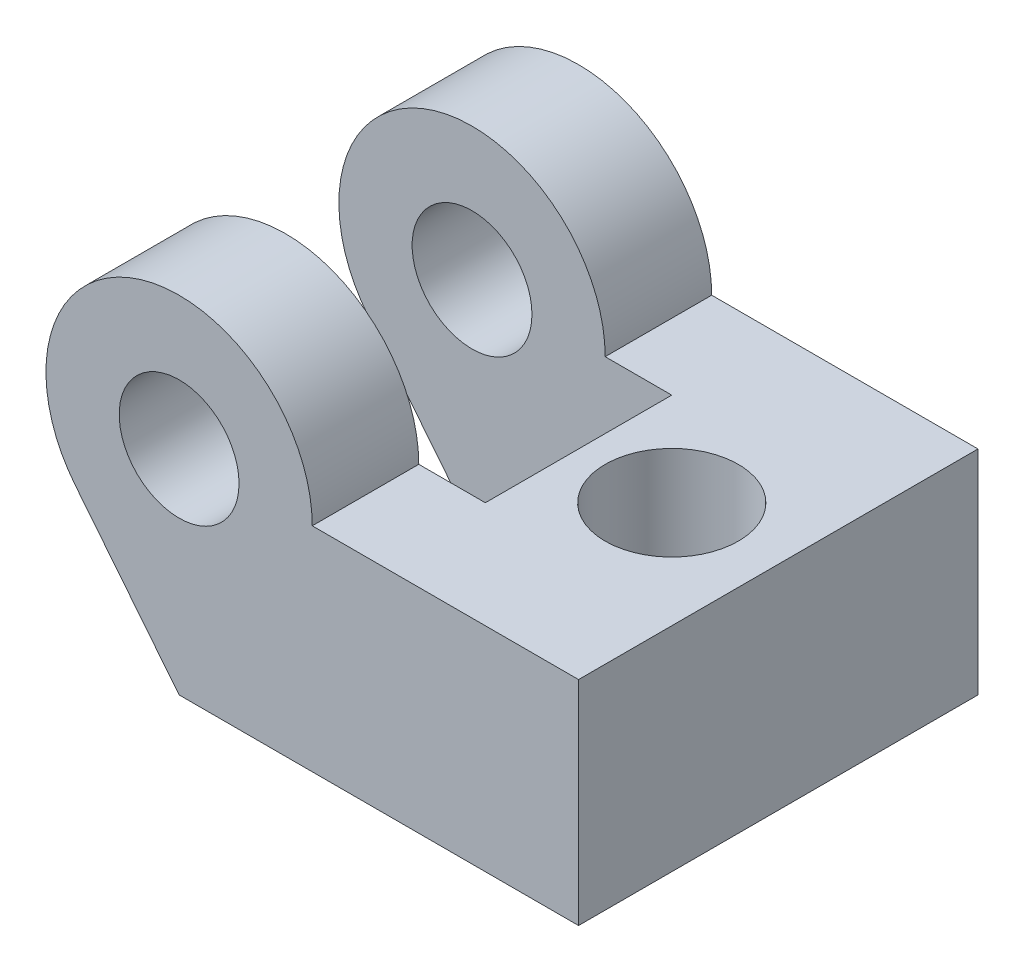
ISO-10303-21;
HEADER;
FILE_DESCRIPTION(('STEP AP214'),'2;1');
FILE_NAME('part.step','',(''),(''),'','','');
FILE_SCHEMA(('AUTOMOTIVE_DESIGN { 1 0 10303 214 1 1 1 1 }'));
ENDSEC;
DATA;
#1=APPLICATION_CONTEXT('core data for automotive mechanical design processes');
#2=APPLICATION_PROTOCOL_DEFINITION('international standard','automotive_design',2000,#1);
#3=PRODUCT_CONTEXT('',#1,'mechanical');
#4=PRODUCT('Part','Part','',(#3));
#5=PRODUCT_RELATED_PRODUCT_CATEGORY('part','',(#4));
#6=PRODUCT_DEFINITION_FORMATION('','',#4);
#7=PRODUCT_DEFINITION_CONTEXT('part definition',#1,'design');
#8=PRODUCT_DEFINITION('design','',#6,#7);
#9=PRODUCT_DEFINITION_SHAPE('','',#8);
#10=(LENGTH_UNIT() NAMED_UNIT(*) SI_UNIT(.MILLI.,.METRE.));
#11=(NAMED_UNIT(*) PLANE_ANGLE_UNIT() SI_UNIT($,.RADIAN.));
#12=(NAMED_UNIT(*) SI_UNIT($,.STERADIAN.) SOLID_ANGLE_UNIT());
#13=UNCERTAINTY_MEASURE_WITH_UNIT(LENGTH_MEASURE(1.E-05),#10,'distance_accuracy_value','');
#14=(GEOMETRIC_REPRESENTATION_CONTEXT(3) GLOBAL_UNCERTAINTY_ASSIGNED_CONTEXT((#13)) GLOBAL_UNIT_ASSIGNED_CONTEXT((#10,
#11,#12)) REPRESENTATION_CONTEXT('',''));
#15=CARTESIAN_POINT('',(0.,0.,0.));
#16=DIRECTION('',(0.,0.,1.));
#17=DIRECTION('',(1.,0.,0.));
#18=AXIS2_PLACEMENT_3D('',#15,#16,#17);
#19=CARTESIAN_POINT('',(0.,8.,0.));
#20=DIRECTION('',(0.,-1.,0.));
#21=DIRECTION('',(0.,0.,-1.));
#22=AXIS2_PLACEMENT_3D('',#19,#20,#21);
#23=PLANE('',#22);
#24=CARTESIAN_POINT('',(-4.,8.,0.));
#25=DIRECTION('',(0.,1.,0.));
#26=DIRECTION('',(0.,0.,1.));
#27=AXIS2_PLACEMENT_3D('',#24,#25,#26);
#28=CIRCLE('',#27,2.5);
#29=CARTESIAN_POINT('',(-4.,8.,2.5));
#30=VERTEX_POINT('',#29);
#31=EDGE_CURVE('E266',#30,#30,#28,.T.);
#32=ORIENTED_EDGE('',*,*,#31,.F.);
#33=EDGE_LOOP('',(#32));
#34=FACE_BOUND('',#33,.T.);
#35=DIRECTION('',(-1.,0.,0.));
#36=VECTOR('',#35,1.);
#37=CARTESIAN_POINT('',(0.,8.,-3.5));
#38=LINE('',#37,#36);
#39=CARTESIAN_POINT('',(-7.5,8.,-3.5));
#40=VERTEX_POINT('',#39);
#41=CARTESIAN_POINT('',(-10.,8.,-3.5));
#42=VERTEX_POINT('',#41);
#43=EDGE_CURVE('E123',#40,#42,#38,.T.);
#44=ORIENTED_EDGE('',*,*,#43,.F.);
#45=DIRECTION('',(0.,0.,-1.));
#46=VECTOR('',#45,1.);
#47=CARTESIAN_POINT('',(-7.5,8.,24.7132034355964));
#48=LINE('',#47,#46);
#49=CARTESIAN_POINT('',(-7.5,8.,3.5));
#50=VERTEX_POINT('',#49);
#51=EDGE_CURVE('E111',#50,#40,#48,.T.);
#52=ORIENTED_EDGE('',*,*,#51,.F.);
#53=DIRECTION('',(-1.,0.,0.));
#54=VECTOR('',#53,1.);
#55=CARTESIAN_POINT('',(0.,8.,3.5));
#56=LINE('',#55,#54);
#57=CARTESIAN_POINT('',(-10.,8.,3.5));
#58=VERTEX_POINT('',#57);
#59=EDGE_CURVE('E117',#50,#58,#56,.T.);
#60=ORIENTED_EDGE('',*,*,#59,.T.);
#61=DIRECTION('',(0.,0.,1.));
#62=VECTOR('',#61,1.);
#63=CARTESIAN_POINT('',(-10.,8.,-16.4012194668567));
#64=LINE('',#63,#62);
#65=CARTESIAN_POINT('',(-10.,8.,7.5));
#66=VERTEX_POINT('',#65);
#67=EDGE_CURVE('E43',#58,#66,#64,.T.);
#68=ORIENTED_EDGE('',*,*,#67,.T.);
#69=DIRECTION('',(1.,0.,0.));
#70=VECTOR('',#69,1.);
#71=CARTESIAN_POINT('',(0.,8.,7.5));
#72=LINE('',#71,#70);
#73=CARTESIAN_POINT('',(0.,8.,7.5));
#74=VERTEX_POINT('',#73);
#75=EDGE_CURVE('E170',#66,#74,#72,.T.);
#76=ORIENTED_EDGE('',*,*,#75,.T.);
#77=DIRECTION('',(0.,0.,-1.));
#78=VECTOR('',#77,1.);
#79=CARTESIAN_POINT('',(0.,8.,-7.5));
#80=LINE('',#79,#78);
#81=CARTESIAN_POINT('',(0.,8.,-7.5));
#82=VERTEX_POINT('',#81);
#83=EDGE_CURVE('E166',#74,#82,#80,.T.);
#84=ORIENTED_EDGE('',*,*,#83,.T.);
#85=DIRECTION('',(-1.,0.,0.));
#86=VECTOR('',#85,1.);
#87=CARTESIAN_POINT('',(0.,8.,-7.5));
#88=LINE('',#87,#86);
#89=CARTESIAN_POINT('',(-10.,8.,-7.5));
#90=VERTEX_POINT('',#89);
#91=EDGE_CURVE('E58',#82,#90,#88,.T.);
#92=ORIENTED_EDGE('',*,*,#91,.T.);
#93=DIRECTION('',(0.,0.,-1.));
#94=VECTOR('',#93,1.);
#95=CARTESIAN_POINT('',(-10.,8.,16.4012194668567));
#96=LINE('',#95,#94);
#97=EDGE_CURVE('E12',#42,#90,#96,.T.);
#98=ORIENTED_EDGE('',*,*,#97,.F.);
#99=EDGE_LOOP('',(#44,#52,#60,#68,#76,#84,#92,#98));
#100=FACE_BOUND('',#99,.T.);
#101=ADVANCED_FACE('F34',(#34,#100),#23,.F.);
#102=CARTESIAN_POINT('',(-15.,8.,-7.5));
#103=DIRECTION('',(1.,0.,0.));
#104=DIRECTION('',(0.,0.,-1.));
#105=AXIS2_PLACEMENT_3D('',#102,#103,#104);
#106=PLANE('',#105);
#107=DIRECTION('',(0.,0.,-1.));
#108=VECTOR('',#107,1.);
#109=CARTESIAN_POINT('',(-15.,0.500000000000001,24.7132034355964));
#110=LINE('',#109,#108);
#111=CARTESIAN_POINT('',(-15.,0.500000000000001,-3.5));
#112=VERTEX_POINT('',#111);
#113=CARTESIAN_POINT('',(-15.,0.500000000000001,3.5));
#114=VERTEX_POINT('',#113);
#115=EDGE_CURVE('E118',#112,#114,#110,.F.);
#116=ORIENTED_EDGE('',*,*,#115,.F.);
#117=DIRECTION('',(0.,1.,0.));
#118=VECTOR('',#117,1.);
#119=CARTESIAN_POINT('',(-15.,0.,-3.5));
#120=LINE('',#119,#118);
#121=CARTESIAN_POINT('',(-15.,0.,-3.5));
#122=VERTEX_POINT('',#121);
#123=EDGE_CURVE('E125',#122,#112,#120,.T.);
#124=ORIENTED_EDGE('',*,*,#123,.F.);
#125=DIRECTION('',(0.,0.,1.));
#126=VECTOR('',#125,1.);
#127=CARTESIAN_POINT('',(-15.,0.,-7.5));
#128=LINE('',#127,#126);
#129=CARTESIAN_POINT('',(-15.,0.,3.5));
#130=VERTEX_POINT('',#129);
#131=EDGE_CURVE('E177',#122,#130,#128,.T.);
#132=ORIENTED_EDGE('',*,*,#131,.T.);
#133=DIRECTION('',(0.,-1.,0.));
#134=VECTOR('',#133,1.);
#135=CARTESIAN_POINT('',(-15.,8.,3.5));
#136=LINE('',#135,#134);
#137=EDGE_CURVE('E163',#114,#130,#136,.T.);
#138=ORIENTED_EDGE('',*,*,#137,.F.);
#139=EDGE_LOOP('',(#116,#124,#132,#138));
#140=FACE_BOUND('',#139,.T.);
#141=ADVANCED_FACE('F223',(#140),#106,.F.);
#142=CARTESIAN_POINT('',(0.,8.,-7.5));
#143=DIRECTION('',(-1.,0.,0.));
#144=DIRECTION('',(0.,0.,1.));
#145=AXIS2_PLACEMENT_3D('',#142,#143,#144);
#146=PLANE('',#145);
#147=DIRECTION('',(0.,0.,-1.));
#148=VECTOR('',#147,1.);
#149=CARTESIAN_POINT('',(0.,0.,-7.5));
#150=LINE('',#149,#148);
#151=CARTESIAN_POINT('',(0.,0.,7.5));
#152=VERTEX_POINT('',#151);
#153=CARTESIAN_POINT('',(0.,0.,-7.5));
#154=VERTEX_POINT('',#153);
#155=EDGE_CURVE('E165',#152,#154,#150,.T.);
#156=ORIENTED_EDGE('',*,*,#155,.T.);
#157=DIRECTION('',(0.,-1.,0.));
#158=VECTOR('',#157,1.);
#159=CARTESIAN_POINT('',(0.,8.,-7.5));
#160=LINE('',#159,#158);
#161=EDGE_CURVE('E184',#82,#154,#160,.T.);
#162=ORIENTED_EDGE('',*,*,#161,.F.);
#163=ORIENTED_EDGE('',*,*,#83,.F.);
#164=DIRECTION('',(0.,-1.,0.));
#165=VECTOR('',#164,1.);
#166=CARTESIAN_POINT('',(0.,8.,7.5));
#167=LINE('',#166,#165);
#168=EDGE_CURVE('E172',#74,#152,#167,.T.);
#169=ORIENTED_EDGE('',*,*,#168,.T.);
#170=EDGE_LOOP('',(#156,#162,#163,#169));
#171=FACE_BOUND('',#170,.T.);
#172=ADVANCED_FACE('F36',(#171),#146,.F.);
#173=CARTESIAN_POINT('',(0.,8.,-7.5));
#174=DIRECTION('',(0.,0.,1.));
#175=DIRECTION('',(1.,0.,0.));
#176=AXIS2_PLACEMENT_3D('',#173,#174,#175);
#177=PLANE('',#176);
#178=CARTESIAN_POINT('',(-15.,8.,-7.5));
#179=DIRECTION('',(0.,0.,1.));
#180=DIRECTION('',(1.,0.,0.));
#181=AXIS2_PLACEMENT_3D('',#178,#179,#180);
#182=CIRCLE('',#181,2.25);
#183=CARTESIAN_POINT('',(-12.75,8.,-7.5));
#184=VERTEX_POINT('',#183);
#185=EDGE_CURVE('E257',#184,#184,#182,.T.);
#186=ORIENTED_EDGE('',*,*,#185,.T.);
#187=EDGE_LOOP('',(#186));
#188=FACE_BOUND('',#187,.T.);
#189=DIRECTION('',(-1.,0.,0.));
#190=VECTOR('',#189,1.);
#191=CARTESIAN_POINT('',(0.,0.,-7.5));
#192=LINE('',#191,#190);
#193=CARTESIAN_POINT('',(-15.,0.,-7.5));
#194=VERTEX_POINT('',#193);
#195=EDGE_CURVE('E175',#154,#194,#192,.T.);
#196=ORIENTED_EDGE('',*,*,#195,.T.);
#197=DIRECTION('',(0.625,-0.7806247497998,0.));
#198=VECTOR('',#197,1.);
#199=CARTESIAN_POINT('',(-18.903123748999,4.875,-7.5));
#200=LINE('',#199,#198);
#201=CARTESIAN_POINT('',(-18.903123748999,4.875,-7.5));
#202=VERTEX_POINT('',#201);
#203=EDGE_CURVE('E137',#202,#194,#200,.T.);
#204=ORIENTED_EDGE('',*,*,#203,.F.);
#205=CARTESIAN_POINT('',(-15.,8.,-7.5));
#206=DIRECTION('',(0.,0.,1.));
#207=DIRECTION('',(1.,0.,0.));
#208=AXIS2_PLACEMENT_3D('',#205,#206,#207);
#209=CIRCLE('',#208,5.);
#210=EDGE_CURVE('E134',#90,#202,#209,.T.);
#211=ORIENTED_EDGE('',*,*,#210,.F.);
#212=ORIENTED_EDGE('',*,*,#91,.F.);
#213=ORIENTED_EDGE('',*,*,#161,.T.);
#214=EDGE_LOOP('',(#196,#204,#211,#212,#213));
#215=FACE_BOUND('',#214,.T.);
#216=ADVANCED_FACE('F212',(#188,#215),#177,.F.);
#217=CARTESIAN_POINT('',(0.,8.,7.5));
#218=DIRECTION('',(0.,0.,-1.));
#219=DIRECTION('',(-1.,0.,0.));
#220=AXIS2_PLACEMENT_3D('',#217,#218,#219);
#221=PLANE('',#220);
#222=CARTESIAN_POINT('',(-15.,8.,7.5));
#223=DIRECTION('',(0.,0.,1.));
#224=DIRECTION('',(1.,0.,0.));
#225=AXIS2_PLACEMENT_3D('',#222,#223,#224);
#226=CIRCLE('',#225,2.25);
#227=CARTESIAN_POINT('',(-12.75,8.,7.5));
#228=VERTEX_POINT('',#227);
#229=EDGE_CURVE('E259',#228,#228,#226,.T.);
#230=ORIENTED_EDGE('',*,*,#229,.F.);
#231=EDGE_LOOP('',(#230));
#232=FACE_BOUND('',#231,.T.);
#233=ORIENTED_EDGE('',*,*,#75,.F.);
#234=CARTESIAN_POINT('',(-15.,8.,7.5));
#235=DIRECTION('',(0.,0.,1.));
#236=DIRECTION('',(1.,0.,0.));
#237=AXIS2_PLACEMENT_3D('',#234,#235,#236);
#238=CIRCLE('',#237,5.);
#239=CARTESIAN_POINT('',(-18.903123748999,4.875,7.5));
#240=VERTEX_POINT('',#239);
#241=EDGE_CURVE('E143',#66,#240,#238,.T.);
#242=ORIENTED_EDGE('',*,*,#241,.T.);
#243=DIRECTION('',(0.625,-0.7806247497998,0.));
#244=VECTOR('',#243,1.);
#245=CARTESIAN_POINT('',(-18.903123748999,4.875,7.5));
#246=LINE('',#245,#244);
#247=CARTESIAN_POINT('',(-15.,0.,7.5));
#248=VERTEX_POINT('',#247);
#249=EDGE_CURVE('E153',#240,#248,#246,.T.);
#250=ORIENTED_EDGE('',*,*,#249,.T.);
#251=DIRECTION('',(1.,0.,0.));
#252=VECTOR('',#251,1.);
#253=CARTESIAN_POINT('',(0.,0.,7.5));
#254=LINE('',#253,#252);
#255=EDGE_CURVE('E168',#248,#152,#254,.T.);
#256=ORIENTED_EDGE('',*,*,#255,.T.);
#257=ORIENTED_EDGE('',*,*,#168,.F.);
#258=EDGE_LOOP('',(#233,#242,#250,#256,#257));
#259=FACE_BOUND('',#258,.T.);
#260=ADVANCED_FACE('F194',(#232,#259),#221,.F.);
#261=CARTESIAN_POINT('',(0.,0.,0.));
#262=DIRECTION('',(0.,-1.,0.));
#263=DIRECTION('',(0.,0.,-1.));
#264=AXIS2_PLACEMENT_3D('',#261,#262,#263);
#265=PLANE('',#264);
#266=CARTESIAN_POINT('',(-4.,0.,0.));
#267=DIRECTION('',(0.,1.,0.));
#268=DIRECTION('',(0.,0.,1.));
#269=AXIS2_PLACEMENT_3D('',#266,#267,#268);
#270=CIRCLE('',#269,2.5);
#271=CARTESIAN_POINT('',(-4.,0.,2.5));
#272=VERTEX_POINT('',#271);
#273=EDGE_CURVE('E263',#272,#272,#270,.T.);
#274=ORIENTED_EDGE('',*,*,#273,.T.);
#275=EDGE_LOOP('',(#274));
#276=FACE_BOUND('',#275,.T.);
#277=ORIENTED_EDGE('',*,*,#155,.F.);
#278=ORIENTED_EDGE('',*,*,#255,.F.);
#279=DIRECTION('',(0.,0.,1.));
#280=VECTOR('',#279,1.);
#281=CARTESIAN_POINT('',(-15.,0.,-16.4012194668567));
#282=LINE('',#281,#280);
#283=EDGE_CURVE('E151',#130,#248,#282,.T.);
#284=ORIENTED_EDGE('',*,*,#283,.F.);
#285=ORIENTED_EDGE('',*,*,#131,.F.);
#286=EDGE_CURVE('E178',#194,#122,#128,.T.);
#287=ORIENTED_EDGE('',*,*,#286,.F.);
#288=ORIENTED_EDGE('',*,*,#195,.F.);
#289=EDGE_LOOP('',(#277,#278,#284,#285,#287,#288));
#290=FACE_BOUND('',#289,.T.);
#291=ADVANCED_FACE('F207',(#276,#290),#265,.T.);
#292=CARTESIAN_POINT('',(-15.,8.,-16.4012194668567));
#293=DIRECTION('',(0.,0.,1.));
#294=DIRECTION('',(1.,0.,0.));
#295=AXIS2_PLACEMENT_3D('',#292,#293,#294);
#296=CYLINDRICAL_SURFACE('',#295,5.);
#297=ORIENTED_EDGE('',*,*,#67,.F.);
#298=CARTESIAN_POINT('',(-15.,8.,3.5));
#299=DIRECTION('',(0.,0.,1.));
#300=DIRECTION('',(1.,0.,0.));
#301=AXIS2_PLACEMENT_3D('',#298,#299,#300);
#302=CIRCLE('',#301,5.);
#303=CARTESIAN_POINT('',(-18.903123748999,4.875,3.5));
#304=VERTEX_POINT('',#303);
#305=EDGE_CURVE('E150',#304,#58,#302,.F.);
#306=ORIENTED_EDGE('',*,*,#305,.F.);
#307=DIRECTION('',(0.,0.,1.));
#308=VECTOR('',#307,1.);
#309=CARTESIAN_POINT('',(-18.903123748999,4.875,-16.4012194668567));
#310=LINE('',#309,#308);
#311=EDGE_CURVE('E156',#304,#240,#310,.T.);
#312=ORIENTED_EDGE('',*,*,#311,.T.);
#313=ORIENTED_EDGE('',*,*,#241,.F.);
#314=EDGE_LOOP('',(#297,#306,#312,#313));
#315=FACE_BOUND('',#314,.T.);
#316=ADVANCED_FACE('F196',(#315),#296,.T.);
#317=CARTESIAN_POINT('',(0.,0.,3.5));
#318=DIRECTION('',(0.,0.,1.));
#319=DIRECTION('',(1.,0.,0.));
#320=AXIS2_PLACEMENT_3D('',#317,#318,#319);
#321=PLANE('',#320);
#322=CARTESIAN_POINT('',(-15.,8.,3.5));
#323=DIRECTION('',(0.,0.,1.));
#324=DIRECTION('',(1.,0.,0.));
#325=AXIS2_PLACEMENT_3D('',#322,#323,#324);
#326=CIRCLE('',#325,2.25);
#327=CARTESIAN_POINT('',(-12.75,8.,3.5));
#328=VERTEX_POINT('',#327);
#329=EDGE_CURVE('E126',#328,#328,#326,.T.);
#330=ORIENTED_EDGE('',*,*,#329,.T.);
#331=EDGE_LOOP('',(#330));
#332=FACE_BOUND('',#331,.T.);
#333=ORIENTED_EDGE('',*,*,#305,.T.);
#334=ORIENTED_EDGE('',*,*,#59,.F.);
#335=CARTESIAN_POINT('',(-15.,8.,3.5));
#336=DIRECTION('',(0.,0.,1.));
#337=DIRECTION('',(1.,0.,0.));
#338=AXIS2_PLACEMENT_3D('',#335,#336,#337);
#339=CIRCLE('',#338,7.5);
#340=EDGE_CURVE('E50',#114,#50,#339,.T.);
#341=ORIENTED_EDGE('',*,*,#340,.F.);
#342=ORIENTED_EDGE('',*,*,#137,.T.);
#343=DIRECTION('',(-0.625,0.7806247497998,0.));
#344=VECTOR('',#343,1.);
#345=CARTESIAN_POINT('',(-18.903123748999,4.875,3.5));
#346=LINE('',#345,#344);
#347=EDGE_CURVE('E148',#130,#304,#346,.T.);
#348=ORIENTED_EDGE('',*,*,#347,.T.);
#349=EDGE_LOOP('',(#333,#334,#341,#342,#348));
#350=FACE_BOUND('',#349,.T.);
#351=ADVANCED_FACE('F224',(#332,#350),#321,.F.);
#352=CARTESIAN_POINT('',(-18.903123748999,4.875,-16.4012194668567));
#353=DIRECTION('',(-0.7806247497998,-0.625,0.));
#354=DIRECTION('',(0.625,-0.7806247497998,0.));
#355=AXIS2_PLACEMENT_3D('',#352,#353,#354);
#356=PLANE('',#355);
#357=ORIENTED_EDGE('',*,*,#347,.F.);
#358=ORIENTED_EDGE('',*,*,#283,.T.);
#359=ORIENTED_EDGE('',*,*,#249,.F.);
#360=ORIENTED_EDGE('',*,*,#311,.F.);
#361=EDGE_LOOP('',(#357,#358,#359,#360));
#362=FACE_BOUND('',#361,.T.);
#363=ADVANCED_FACE('F201',(#362),#356,.T.);
#364=CARTESIAN_POINT('',(-15.,8.,16.4012194668567));
#365=DIRECTION('',(0.,0.,-1.));
#366=DIRECTION('',(-1.,0.,0.));
#367=AXIS2_PLACEMENT_3D('',#364,#365,#366);
#368=CYLINDRICAL_SURFACE('',#367,5.);
#369=CARTESIAN_POINT('',(-15.,8.,-3.5));
#370=DIRECTION('',(0.,0.,1.));
#371=DIRECTION('',(1.,0.,0.));
#372=AXIS2_PLACEMENT_3D('',#369,#370,#371);
#373=CIRCLE('',#372,5.);
#374=CARTESIAN_POINT('',(-18.903123748999,4.875,-3.5));
#375=VERTEX_POINT('',#374);
#376=EDGE_CURVE('E141',#42,#375,#373,.T.);
#377=ORIENTED_EDGE('',*,*,#376,.F.);
#378=ORIENTED_EDGE('',*,*,#97,.T.);
#379=ORIENTED_EDGE('',*,*,#210,.T.);
#380=DIRECTION('',(0.,0.,-1.));
#381=VECTOR('',#380,1.);
#382=CARTESIAN_POINT('',(-18.903123748999,4.875,16.4012194668567));
#383=LINE('',#382,#381);
#384=EDGE_CURVE('E136',#375,#202,#383,.T.);
#385=ORIENTED_EDGE('',*,*,#384,.F.);
#386=EDGE_LOOP('',(#377,#378,#379,#385));
#387=FACE_BOUND('',#386,.T.);
#388=ADVANCED_FACE('F216',(#387),#368,.T.);
#389=CARTESIAN_POINT('',(0.,0.,-3.5));
#390=DIRECTION('',(0.,0.,1.));
#391=DIRECTION('',(1.,0.,0.));
#392=AXIS2_PLACEMENT_3D('',#389,#390,#391);
#393=PLANE('',#392);
#394=CARTESIAN_POINT('',(-15.,8.,-3.5));
#395=DIRECTION('',(0.,0.,1.));
#396=DIRECTION('',(1.,0.,0.));
#397=AXIS2_PLACEMENT_3D('',#394,#395,#396);
#398=CIRCLE('',#397,2.25);
#399=CARTESIAN_POINT('',(-12.75,8.,-3.5));
#400=VERTEX_POINT('',#399);
#401=EDGE_CURVE('E38',#400,#400,#398,.T.);
#402=ORIENTED_EDGE('',*,*,#401,.F.);
#403=EDGE_LOOP('',(#402));
#404=FACE_BOUND('',#403,.T.);
#405=DIRECTION('',(0.625,-0.7806247497998,0.));
#406=VECTOR('',#405,1.);
#407=CARTESIAN_POINT('',(-18.903123748999,4.875,-3.5));
#408=LINE('',#407,#406);
#409=EDGE_CURVE('E140',#375,#122,#408,.T.);
#410=ORIENTED_EDGE('',*,*,#409,.T.);
#411=ORIENTED_EDGE('',*,*,#123,.T.);
#412=CARTESIAN_POINT('',(-15.,8.,-3.5));
#413=DIRECTION('',(0.,0.,1.));
#414=DIRECTION('',(1.,0.,0.));
#415=AXIS2_PLACEMENT_3D('',#412,#413,#414);
#416=CIRCLE('',#415,7.5);
#417=EDGE_CURVE('E114',#112,#40,#416,.T.);
#418=ORIENTED_EDGE('',*,*,#417,.T.);
#419=ORIENTED_EDGE('',*,*,#43,.T.);
#420=ORIENTED_EDGE('',*,*,#376,.T.);
#421=EDGE_LOOP('',(#410,#411,#418,#419,#420));
#422=FACE_BOUND('',#421,.T.);
#423=ADVANCED_FACE('F122',(#404,#422),#393,.T.);
#424=CARTESIAN_POINT('',(-18.903123748999,4.875,16.4012194668567));
#425=DIRECTION('',(0.7806247497998,0.625,0.));
#426=DIRECTION('',(-0.625,0.7806247497998,0.));
#427=AXIS2_PLACEMENT_3D('',#424,#425,#426);
#428=PLANE('',#427);
#429=ORIENTED_EDGE('',*,*,#409,.F.);
#430=ORIENTED_EDGE('',*,*,#384,.T.);
#431=ORIENTED_EDGE('',*,*,#203,.T.);
#432=ORIENTED_EDGE('',*,*,#286,.T.);
#433=EDGE_LOOP('',(#429,#430,#431,#432));
#434=FACE_BOUND('',#433,.T.);
#435=ADVANCED_FACE('F219',(#434),#428,.F.);
#436=CARTESIAN_POINT('',(-15.,8.,24.7132034355964));
#437=DIRECTION('',(0.,0.,-1.));
#438=DIRECTION('',(-1.,0.,0.));
#439=AXIS2_PLACEMENT_3D('',#436,#437,#438);
#440=CYLINDRICAL_SURFACE('',#439,7.5);
#441=ORIENTED_EDGE('',*,*,#51,.T.);
#442=ORIENTED_EDGE('',*,*,#417,.F.);
#443=ORIENTED_EDGE('',*,*,#115,.T.);
#444=ORIENTED_EDGE('',*,*,#340,.T.);
#445=EDGE_LOOP('',(#441,#442,#443,#444));
#446=FACE_BOUND('',#445,.T.);
#447=ADVANCED_FACE('F113',(#446),#440,.F.);
#448=CARTESIAN_POINT('',(-15.,8.,-7.5));
#449=DIRECTION('',(0.,0.,1.));
#450=DIRECTION('',(1.,0.,0.));
#451=AXIS2_PLACEMENT_3D('',#448,#449,#450);
#452=CYLINDRICAL_SURFACE('',#451,2.25);
#453=CARTESIAN_POINT('',(-12.75,8.,-3.5));
#454=CARTESIAN_POINT('',(-12.75,8.,-3.54166666666667));
#455=CARTESIAN_POINT('',(-12.75,8.,-3.58333333333333));
#456=CARTESIAN_POINT('',(-12.75,8.,-3.66666666666667));
#457=CARTESIAN_POINT('',(-12.75,8.,-3.70833333333333));
#458=CARTESIAN_POINT('',(-12.75,8.,-3.79166666666667));
#459=CARTESIAN_POINT('',(-12.75,8.,-3.83333333333333));
#460=CARTESIAN_POINT('',(-12.75,8.,-3.91666666666667));
#461=CARTESIAN_POINT('',(-12.75,8.,-3.95833333333333));
#462=CARTESIAN_POINT('',(-12.75,8.,-4.04166666666667));
#463=CARTESIAN_POINT('',(-12.75,8.,-4.08333333333333));
#464=CARTESIAN_POINT('',(-12.75,8.,-4.16666666666667));
#465=CARTESIAN_POINT('',(-12.75,8.,-4.20833333333333));
#466=CARTESIAN_POINT('',(-12.75,8.,-4.29166666666667));
#467=CARTESIAN_POINT('',(-12.75,8.,-4.33333333333333));
#468=CARTESIAN_POINT('',(-12.75,8.,-4.41666666666667));
#469=CARTESIAN_POINT('',(-12.75,8.,-4.45833333333333));
#470=CARTESIAN_POINT('',(-12.75,8.,-4.54166666666667));
#471=CARTESIAN_POINT('',(-12.75,8.,-4.58333333333333));
#472=CARTESIAN_POINT('',(-12.75,8.,-4.66666666666667));
#473=CARTESIAN_POINT('',(-12.75,8.,-4.70833333333333));
#474=CARTESIAN_POINT('',(-12.75,8.,-4.79166666666667));
#475=CARTESIAN_POINT('',(-12.75,8.,-4.83333333333333));
#476=CARTESIAN_POINT('',(-12.75,8.,-4.91666666666667));
#477=CARTESIAN_POINT('',(-12.75,8.,-4.95833333333333));
#478=CARTESIAN_POINT('',(-12.75,8.,-5.04166666666667));
#479=CARTESIAN_POINT('',(-12.75,8.,-5.08333333333333));
#480=CARTESIAN_POINT('',(-12.75,8.,-5.16666666666667));
#481=CARTESIAN_POINT('',(-12.75,8.,-5.20833333333333));
#482=CARTESIAN_POINT('',(-12.75,8.,-5.29166666666667));
#483=CARTESIAN_POINT('',(-12.75,8.,-5.33333333333333));
#484=CARTESIAN_POINT('',(-12.75,8.,-5.41666666666667));
#485=CARTESIAN_POINT('',(-12.75,8.,-5.45833333333333));
#486=CARTESIAN_POINT('',(-12.75,8.,-5.54166666666667));
#487=CARTESIAN_POINT('',(-12.75,8.,-5.58333333333333));
#488=CARTESIAN_POINT('',(-12.75,8.,-5.66666666666667));
#489=CARTESIAN_POINT('',(-12.75,8.,-5.70833333333333));
#490=CARTESIAN_POINT('',(-12.75,8.,-5.79166666666667));
#491=CARTESIAN_POINT('',(-12.75,8.,-5.83333333333334));
#492=CARTESIAN_POINT('',(-12.75,8.,-5.91666666666667));
#493=CARTESIAN_POINT('',(-12.75,8.,-5.95833333333334));
#494=CARTESIAN_POINT('',(-12.75,8.,-6.04166666666667));
#495=CARTESIAN_POINT('',(-12.75,8.,-6.08333333333334));
#496=CARTESIAN_POINT('',(-12.75,8.,-6.16666666666667));
#497=CARTESIAN_POINT('',(-12.75,8.,-6.20833333333334));
#498=CARTESIAN_POINT('',(-12.75,8.,-6.29166666666667));
#499=CARTESIAN_POINT('',(-12.75,8.,-6.33333333333334));
#500=CARTESIAN_POINT('',(-12.75,8.,-6.41666666666667));
#501=CARTESIAN_POINT('',(-12.75,8.,-6.45833333333333));
#502=CARTESIAN_POINT('',(-12.75,8.,-6.54166666666667));
#503=CARTESIAN_POINT('',(-12.75,8.,-6.58333333333333));
#504=CARTESIAN_POINT('',(-12.75,8.,-6.66666666666667));
#505=CARTESIAN_POINT('',(-12.75,8.,-6.70833333333333));
#506=CARTESIAN_POINT('',(-12.75,8.,-6.79166666666667));
#507=CARTESIAN_POINT('',(-12.75,8.,-6.83333333333334));
#508=CARTESIAN_POINT('',(-12.75,8.,-6.91666666666667));
#509=CARTESIAN_POINT('',(-12.75,8.,-6.95833333333334));
#510=CARTESIAN_POINT('',(-12.75,8.,-7.04166666666667));
#511=CARTESIAN_POINT('',(-12.75,8.,-7.08333333333334));
#512=CARTESIAN_POINT('',(-12.75,8.,-7.16666666666667));
#513=CARTESIAN_POINT('',(-12.75,8.,-7.20833333333334));
#514=CARTESIAN_POINT('',(-12.75,8.,-7.29166666666667));
#515=CARTESIAN_POINT('',(-12.75,8.,-7.33333333333334));
#516=CARTESIAN_POINT('',(-12.75,8.,-7.41666666666667));
#517=CARTESIAN_POINT('',(-12.75,8.,-7.45833333333334));
#518=CARTESIAN_POINT('',(-12.75,8.,-7.5));
#519=B_SPLINE_CURVE_WITH_KNOTS('',3,(#453,#454,#455,#456,#457,#458,#459,#460,#461,#462,#463,
#464,#465,#466,#467,#468,#469,#470,#471,#472,#473,#474,#475,#476,#477,#478,#479,#480,#481,#482,
#483,#484,#485,#486,#487,#488,#489,#490,#491,#492,#493,#494,#495,#496,#497,#498,#499,#500,#501,
#502,#503,#504,#505,#506,#507,#508,#509,#510,#511,#512,#513,#514,#515,#516,#517,#518),
.UNSPECIFIED.,.F.,.F.,(4,2,2,2,2,2,2,2,2,2,2,2,2,2,2,2,2,2,2,2,2,2,2,2,2,2,2,2,2,2,2,2,4),(0.,
0.125,0.25,0.375,0.5,0.625,0.75,0.875,1.,1.125,1.25,1.375,1.5,1.625,1.75,1.875,2.,2.125,2.25,
2.375,2.5,2.625,2.75,2.875,3.,3.125,3.25,3.375,3.5,3.625,3.75,3.875,4.),.UNSPECIFIED.);
#520=EDGE_CURVE('BSEAM274',#400,#184,#519,.T.);
#521=ORIENTED_EDGE('',*,*,#401,.T.);
#522=ORIENTED_EDGE('',*,*,#185,.F.);
#523=ORIENTED_EDGE('',*,*,#520,.T.);
#524=ORIENTED_EDGE('',*,*,#520,.F.);
#525=EDGE_LOOP('',(#521,#523,#522,#524));
#526=FACE_BOUND('',#525,.T.);
#527=ADVANCED_FACE('F274',(#526),#452,.F.);
#528=CARTESIAN_POINT('',(-12.75,8.,7.5));
#529=CARTESIAN_POINT('',(-12.75,8.,7.45833333333333));
#530=CARTESIAN_POINT('',(-12.75,8.,7.41666666666667));
#531=CARTESIAN_POINT('',(-12.75,8.,7.33333333333333));
#532=CARTESIAN_POINT('',(-12.75,8.,7.29166666666667));
#533=CARTESIAN_POINT('',(-12.75,8.,7.20833333333333));
#534=CARTESIAN_POINT('',(-12.75,8.,7.16666666666667));
#535=CARTESIAN_POINT('',(-12.75,8.,7.08333333333333));
#536=CARTESIAN_POINT('',(-12.75,8.,7.04166666666667));
#537=CARTESIAN_POINT('',(-12.75,8.,6.95833333333333));
#538=CARTESIAN_POINT('',(-12.75,8.,6.91666666666667));
#539=CARTESIAN_POINT('',(-12.75,8.,6.83333333333333));
#540=CARTESIAN_POINT('',(-12.75,8.,6.79166666666667));
#541=CARTESIAN_POINT('',(-12.75,8.,6.70833333333333));
#542=CARTESIAN_POINT('',(-12.75,8.,6.66666666666667));
#543=CARTESIAN_POINT('',(-12.75,8.,6.58333333333333));
#544=CARTESIAN_POINT('',(-12.75,8.,6.54166666666667));
#545=CARTESIAN_POINT('',(-12.75,8.,6.45833333333333));
#546=CARTESIAN_POINT('',(-12.75,8.,6.41666666666667));
#547=CARTESIAN_POINT('',(-12.75,8.,6.33333333333333));
#548=CARTESIAN_POINT('',(-12.75,8.,6.29166666666667));
#549=CARTESIAN_POINT('',(-12.75,8.,6.20833333333333));
#550=CARTESIAN_POINT('',(-12.75,8.,6.16666666666667));
#551=CARTESIAN_POINT('',(-12.75,8.,6.08333333333333));
#552=CARTESIAN_POINT('',(-12.75,8.,6.04166666666667));
#553=CARTESIAN_POINT('',(-12.75,8.,5.95833333333333));
#554=CARTESIAN_POINT('',(-12.75,8.,5.91666666666667));
#555=CARTESIAN_POINT('',(-12.75,8.,5.83333333333333));
#556=CARTESIAN_POINT('',(-12.75,8.,5.79166666666667));
#557=CARTESIAN_POINT('',(-12.75,8.,5.70833333333333));
#558=CARTESIAN_POINT('',(-12.75,8.,5.66666666666667));
#559=CARTESIAN_POINT('',(-12.75,8.,5.58333333333333));
#560=CARTESIAN_POINT('',(-12.75,8.,5.54166666666667));
#561=CARTESIAN_POINT('',(-12.75,8.,5.45833333333333));
#562=CARTESIAN_POINT('',(-12.75,8.,5.41666666666667));
#563=CARTESIAN_POINT('',(-12.75,8.,5.33333333333333));
#564=CARTESIAN_POINT('',(-12.75,8.,5.29166666666667));
#565=CARTESIAN_POINT('',(-12.75,8.,5.20833333333333));
#566=CARTESIAN_POINT('',(-12.75,8.,5.16666666666667));
#567=CARTESIAN_POINT('',(-12.75,8.,5.08333333333333));
#568=CARTESIAN_POINT('',(-12.75,8.,5.04166666666667));
#569=CARTESIAN_POINT('',(-12.75,8.,4.95833333333333));
#570=CARTESIAN_POINT('',(-12.75,8.,4.91666666666667));
#571=CARTESIAN_POINT('',(-12.75,8.,4.83333333333333));
#572=CARTESIAN_POINT('',(-12.75,8.,4.79166666666667));
#573=CARTESIAN_POINT('',(-12.75,8.,4.70833333333333));
#574=CARTESIAN_POINT('',(-12.75,8.,4.66666666666667));
#575=CARTESIAN_POINT('',(-12.75,8.,4.58333333333333));
#576=CARTESIAN_POINT('',(-12.75,8.,4.54166666666667));
#577=CARTESIAN_POINT('',(-12.75,8.,4.45833333333333));
#578=CARTESIAN_POINT('',(-12.75,8.,4.41666666666667));
#579=CARTESIAN_POINT('',(-12.75,8.,4.33333333333333));
#580=CARTESIAN_POINT('',(-12.75,8.,4.29166666666667));
#581=CARTESIAN_POINT('',(-12.75,8.,4.20833333333333));
#582=CARTESIAN_POINT('',(-12.75,8.,4.16666666666667));
#583=CARTESIAN_POINT('',(-12.75,8.,4.08333333333333));
#584=CARTESIAN_POINT('',(-12.75,8.,4.04166666666667));
#585=CARTESIAN_POINT('',(-12.75,8.,3.95833333333333));
#586=CARTESIAN_POINT('',(-12.75,8.,3.91666666666667));
#587=CARTESIAN_POINT('',(-12.75,8.,3.83333333333333));
#588=CARTESIAN_POINT('',(-12.75,8.,3.79166666666667));
#589=CARTESIAN_POINT('',(-12.75,8.,3.70833333333333));
#590=CARTESIAN_POINT('',(-12.75,8.,3.66666666666667));
#591=CARTESIAN_POINT('',(-12.75,8.,3.58333333333333));
#592=CARTESIAN_POINT('',(-12.75,8.,3.54166666666667));
#593=CARTESIAN_POINT('',(-12.75,8.,3.5));
#594=B_SPLINE_CURVE_WITH_KNOTS('',3,(#528,#529,#530,#531,#532,#533,#534,#535,#536,#537,#538,
#539,#540,#541,#542,#543,#544,#545,#546,#547,#548,#549,#550,#551,#552,#553,#554,#555,#556,#557,
#558,#559,#560,#561,#562,#563,#564,#565,#566,#567,#568,#569,#570,#571,#572,#573,#574,#575,#576,
#577,#578,#579,#580,#581,#582,#583,#584,#585,#586,#587,#588,#589,#590,#591,#592,#593),
.UNSPECIFIED.,.F.,.F.,(4,2,2,2,2,2,2,2,2,2,2,2,2,2,2,2,2,2,2,2,2,2,2,2,2,2,2,2,2,2,2,2,4),(0.,
0.125,0.25,0.375,0.5,0.625000000000001,0.750000000000001,0.875000000000001,1.,1.125,1.25,1.375,
1.5,1.625,1.75,1.875,2.,2.125,2.25,2.375,2.5,2.625,2.75,2.875,3.,3.125,3.25,3.375,3.5,3.625,
3.75,3.875,4.),.UNSPECIFIED.);
#595=EDGE_CURVE('BSEAM271',#228,#328,#594,.T.);
#596=ORIENTED_EDGE('',*,*,#229,.T.);
#597=ORIENTED_EDGE('',*,*,#329,.F.);
#598=ORIENTED_EDGE('',*,*,#595,.T.);
#599=ORIENTED_EDGE('',*,*,#595,.F.);
#600=EDGE_LOOP('',(#596,#598,#597,#599));
#601=FACE_BOUND('',#600,.T.);
#602=ADVANCED_FACE('F271',(#601),#452,.F.);
#603=CARTESIAN_POINT('',(-4.,0.,0.));
#604=DIRECTION('',(0.,1.,0.));
#605=DIRECTION('',(0.,0.,1.));
#606=AXIS2_PLACEMENT_3D('',#603,#604,#605);
#607=CYLINDRICAL_SURFACE('',#606,2.5);
#608=ORIENTED_EDGE('',*,*,#273,.F.);
#609=EDGE_LOOP('',(#608));
#610=FACE_BOUND('',#609,.T.);
#611=ORIENTED_EDGE('',*,*,#31,.T.);
#612=EDGE_LOOP('',(#611));
#613=FACE_BOUND('',#612,.T.);
#614=ADVANCED_FACE('F273',(#610,#613),#607,.F.);
#615=CLOSED_SHELL('',(#101,#141,#172,#216,#260,#291,#316,#351,#363,#388,#423,#435,#447,#527,
#602,#614));
#616=MANIFOLD_SOLID_BREP('B2',#615);
#617=ADVANCED_BREP_SHAPE_REPRESENTATION('',(#18,#616),#14);
#618=SHAPE_DEFINITION_REPRESENTATION(#9,#617);
ENDSEC;
END-ISO-10303-21;
